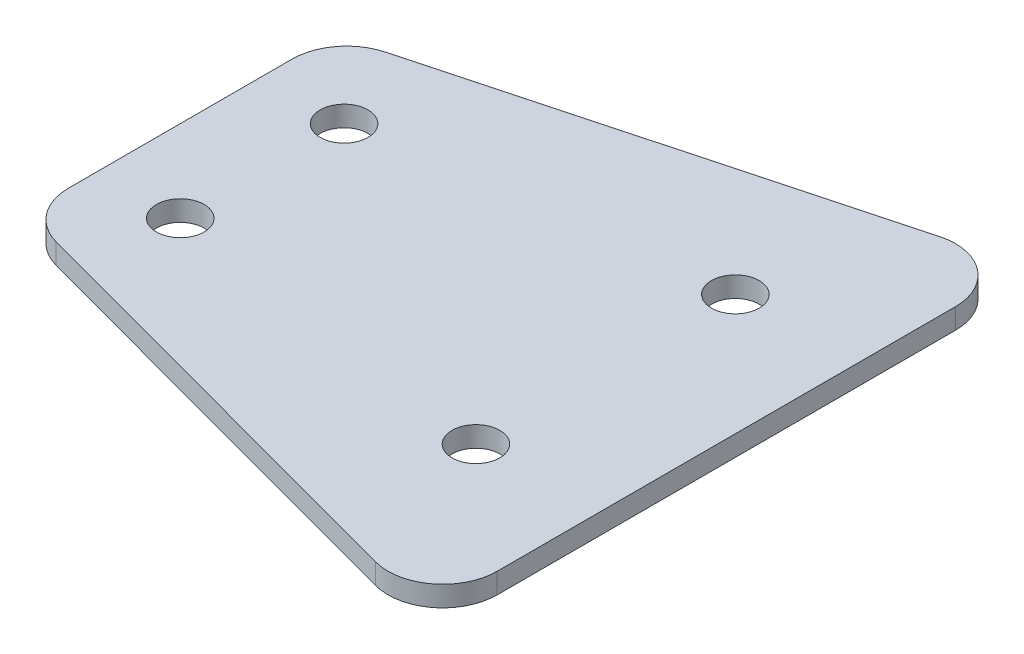
ISO-10303-21;
HEADER;
FILE_DESCRIPTION(('STEP AP214'),'2;1');
FILE_NAME('part.step','',(''),(''),'','','');
FILE_SCHEMA(('AUTOMOTIVE_DESIGN { 1 0 10303 214 1 1 1 1 }'));
ENDSEC;
DATA;
#1=APPLICATION_CONTEXT('core data for automotive mechanical design processes');
#2=APPLICATION_PROTOCOL_DEFINITION('international standard','automotive_design',2000,#1);
#3=PRODUCT_CONTEXT('',#1,'mechanical');
#4=PRODUCT('Part','Part','',(#3));
#5=PRODUCT_RELATED_PRODUCT_CATEGORY('part','',(#4));
#6=PRODUCT_DEFINITION_FORMATION('','',#4);
#7=PRODUCT_DEFINITION_CONTEXT('part definition',#1,'design');
#8=PRODUCT_DEFINITION('design','',#6,#7);
#9=PRODUCT_DEFINITION_SHAPE('','',#8);
#10=(LENGTH_UNIT() NAMED_UNIT(*) SI_UNIT(.MILLI.,.METRE.));
#11=(NAMED_UNIT(*) PLANE_ANGLE_UNIT() SI_UNIT($,.RADIAN.));
#12=(NAMED_UNIT(*) SI_UNIT($,.STERADIAN.) SOLID_ANGLE_UNIT());
#13=UNCERTAINTY_MEASURE_WITH_UNIT(LENGTH_MEASURE(1.E-05),#10,'distance_accuracy_value','');
#14=(GEOMETRIC_REPRESENTATION_CONTEXT(3) GLOBAL_UNCERTAINTY_ASSIGNED_CONTEXT((#13)) GLOBAL_UNIT_ASSIGNED_CONTEXT((#10,
#11,#12)) REPRESENTATION_CONTEXT('',''));
#15=CARTESIAN_POINT('',(0.,0.,0.));
#16=DIRECTION('',(0.,0.,1.));
#17=DIRECTION('',(1.,0.,0.));
#18=AXIS2_PLACEMENT_3D('',#15,#16,#17);
#19=CARTESIAN_POINT('',(-40.,1.5,0.));
#20=DIRECTION('',(-1.,0.,0.));
#21=DIRECTION('',(0.,0.,1.));
#22=AXIS2_PLACEMENT_3D('',#19,#20,#21);
#23=PLANE('',#22);
#24=DIRECTION('',(0.,0.,-1.));
#25=VECTOR('',#24,1.);
#26=CARTESIAN_POINT('',(-40.,-1.5,0.));
#27=LINE('',#26,#25);
#28=CARTESIAN_POINT('',(-40.,-1.5,16.3661301313939));
#29=VERTEX_POINT('',#28);
#30=CARTESIAN_POINT('',(-40.,-1.5,-16.3661301313939));
#31=VERTEX_POINT('',#30);
#32=EDGE_CURVE('E146',#29,#31,#27,.T.);
#33=ORIENTED_EDGE('',*,*,#32,.F.);
#34=DIRECTION('',(0.,-1.,0.));
#35=VECTOR('',#34,1.);
#36=CARTESIAN_POINT('',(-40.,1.5,16.3661301313939));
#37=LINE('',#36,#35);
#38=CARTESIAN_POINT('',(-40.,1.5,16.3661301313939));
#39=VERTEX_POINT('',#38);
#40=EDGE_CURVE('E11',#39,#29,#37,.T.);
#41=ORIENTED_EDGE('',*,*,#40,.F.);
#42=DIRECTION('',(0.,0.,-1.));
#43=VECTOR('',#42,1.);
#44=CARTESIAN_POINT('',(-40.,1.5,0.));
#45=LINE('',#44,#43);
#46=CARTESIAN_POINT('',(-40.,1.5,-16.3661301313939));
#47=VERTEX_POINT('',#46);
#48=EDGE_CURVE('E176',#39,#47,#45,.T.);
#49=ORIENTED_EDGE('',*,*,#48,.T.);
#50=DIRECTION('',(0.,-1.,0.));
#51=VECTOR('',#50,1.);
#52=CARTESIAN_POINT('',(-40.,1.5,-16.3661301313939));
#53=LINE('',#52,#51);
#54=EDGE_CURVE('E66',#47,#31,#53,.T.);
#55=ORIENTED_EDGE('',*,*,#54,.T.);
#56=EDGE_LOOP('',(#33,#41,#49,#55));
#57=FACE_BOUND('',#56,.T.);
#58=ADVANCED_FACE('F51',(#57),#23,.T.);
#59=CARTESIAN_POINT('',(-32.,1.5,16.3661301313939));
#60=DIRECTION('',(0.,-1.,0.));
#61=DIRECTION('',(0.,0.,-1.));
#62=AXIS2_PLACEMENT_3D('',#59,#60,#61);
#63=CYLINDRICAL_SURFACE('',#62,7.99999999999999);
#64=CARTESIAN_POINT('',(-32.,-1.5,16.3661301313939));
#65=DIRECTION('',(0.,1.,0.));
#66=DIRECTION('',(0.,0.,1.));
#67=AXIS2_PLACEMENT_3D('',#64,#65,#66);
#68=CIRCLE('',#67,7.99999999999999);
#69=CARTESIAN_POINT('',(-34.0763242630336,-1.5,24.0919878543097));
#70=VERTEX_POINT('',#69);
#71=EDGE_CURVE('E155',#29,#70,#68,.T.);
#72=ORIENTED_EDGE('',*,*,#71,.T.);
#73=DIRECTION('',(0.,-1.,0.));
#74=VECTOR('',#73,1.);
#75=CARTESIAN_POINT('',(-34.0763242630336,1.5,24.0919878543097));
#76=LINE('',#75,#74);
#77=CARTESIAN_POINT('',(-34.0763242630336,1.5,24.0919878543097));
#78=VERTEX_POINT('',#77);
#79=EDGE_CURVE('E58',#78,#70,#76,.T.);
#80=ORIENTED_EDGE('',*,*,#79,.F.);
#81=CARTESIAN_POINT('',(-32.,1.5,16.3661301313939));
#82=DIRECTION('',(0.,1.,0.));
#83=DIRECTION('',(0.,0.,1.));
#84=AXIS2_PLACEMENT_3D('',#81,#82,#83);
#85=CIRCLE('',#84,7.99999999999999);
#86=EDGE_CURVE('E214',#39,#78,#85,.T.);
#87=ORIENTED_EDGE('',*,*,#86,.F.);
#88=ORIENTED_EDGE('',*,*,#40,.T.);
#89=EDGE_LOOP('',(#72,#80,#87,#88));
#90=FACE_BOUND('',#89,.T.);
#91=ADVANCED_FACE('F279',(#90),#63,.T.);
#92=CARTESIAN_POINT('',(-8.33400123866079,1.5,31.0102371671099));
#93=DIRECTION('',(0.259540532879203,0.,-0.965732215364476));
#94=DIRECTION('',(-0.965732215364476,0.,-0.259540532879203));
#95=AXIS2_PLACEMENT_3D('',#92,#93,#94);
#96=PLANE('',#95);
#97=DIRECTION('',(0.965732215364476,0.,0.259540532879203));
#98=VECTOR('',#97,1.);
#99=CARTESIAN_POINT('',(-8.33400123866079,-1.5,31.0102371671099));
#100=LINE('',#99,#98);
#101=CARTESIAN_POINT('',(29.9236757369664,-1.5,41.2919878543097));
#102=VERTEX_POINT('',#101);
#103=EDGE_CURVE('E158',#70,#102,#100,.T.);
#104=ORIENTED_EDGE('',*,*,#103,.T.);
#105=DIRECTION('',(0.,-1.,0.));
#106=VECTOR('',#105,1.);
#107=CARTESIAN_POINT('',(29.9236757369664,1.5,41.2919878543097));
#108=LINE('',#107,#106);
#109=CARTESIAN_POINT('',(29.9236757369664,1.5,41.2919878543097));
#110=VERTEX_POINT('',#109);
#111=EDGE_CURVE('E187',#110,#102,#108,.T.);
#112=ORIENTED_EDGE('',*,*,#111,.F.);
#113=DIRECTION('',(0.965732215364476,0.,0.259540532879203));
#114=VECTOR('',#113,1.);
#115=CARTESIAN_POINT('',(-8.33400123866079,1.5,31.0102371671099));
#116=LINE('',#115,#114);
#117=EDGE_CURVE('E200',#78,#110,#116,.T.);
#118=ORIENTED_EDGE('',*,*,#117,.F.);
#119=ORIENTED_EDGE('',*,*,#79,.T.);
#120=EDGE_LOOP('',(#104,#112,#118,#119));
#121=FACE_BOUND('',#120,.T.);
#122=ADVANCED_FACE('F193',(#121),#96,.F.);
#123=CARTESIAN_POINT('',(32.,1.5,33.5661301313939));
#124=DIRECTION('',(0.,-1.,0.));
#125=DIRECTION('',(0.,0.,-1.));
#126=AXIS2_PLACEMENT_3D('',#123,#124,#125);
#127=CYLINDRICAL_SURFACE('',#126,8.);
#128=CARTESIAN_POINT('',(32.,-1.5,33.5661301313939));
#129=DIRECTION('',(0.,1.,0.));
#130=DIRECTION('',(0.,0.,1.));
#131=AXIS2_PLACEMENT_3D('',#128,#129,#130);
#132=CIRCLE('',#131,8.);
#133=CARTESIAN_POINT('',(40.,-1.5,33.5661301313939));
#134=VERTEX_POINT('',#133);
#135=EDGE_CURVE('E160',#102,#134,#132,.T.);
#136=ORIENTED_EDGE('',*,*,#135,.T.);
#137=DIRECTION('',(0.,-1.,0.));
#138=VECTOR('',#137,1.);
#139=CARTESIAN_POINT('',(40.,1.5,33.5661301313939));
#140=LINE('',#139,#138);
#141=CARTESIAN_POINT('',(40.,1.5,33.5661301313939));
#142=VERTEX_POINT('',#141);
#143=EDGE_CURVE('E182',#142,#134,#140,.T.);
#144=ORIENTED_EDGE('',*,*,#143,.F.);
#145=CARTESIAN_POINT('',(32.,1.5,33.5661301313939));
#146=DIRECTION('',(0.,1.,0.));
#147=DIRECTION('',(0.,0.,1.));
#148=AXIS2_PLACEMENT_3D('',#145,#146,#147);
#149=CIRCLE('',#148,8.);
#150=EDGE_CURVE('E206',#110,#142,#149,.T.);
#151=ORIENTED_EDGE('',*,*,#150,.F.);
#152=ORIENTED_EDGE('',*,*,#111,.T.);
#153=EDGE_LOOP('',(#136,#144,#151,#152));
#154=FACE_BOUND('',#153,.T.);
#155=ADVANCED_FACE('F207',(#154),#127,.T.);
#156=CARTESIAN_POINT('',(40.,1.5,0.));
#157=DIRECTION('',(1.,0.,0.));
#158=DIRECTION('',(0.,0.,-1.));
#159=AXIS2_PLACEMENT_3D('',#156,#157,#158);
#160=PLANE('',#159);
#161=DIRECTION('',(0.,0.,1.));
#162=VECTOR('',#161,1.);
#163=CARTESIAN_POINT('',(40.,-1.5,0.));
#164=LINE('',#163,#162);
#165=CARTESIAN_POINT('',(40.,-1.5,-33.5661301313939));
#166=VERTEX_POINT('',#165);
#167=EDGE_CURVE('E161',#166,#134,#164,.T.);
#168=ORIENTED_EDGE('',*,*,#167,.F.);
#169=DIRECTION('',(0.,-1.,0.));
#170=VECTOR('',#169,1.);
#171=CARTESIAN_POINT('',(40.,1.5,-33.5661301313939));
#172=LINE('',#171,#170);
#173=CARTESIAN_POINT('',(40.,1.5,-33.5661301313939));
#174=VERTEX_POINT('',#173);
#175=EDGE_CURVE('E129',#174,#166,#172,.T.);
#176=ORIENTED_EDGE('',*,*,#175,.F.);
#177=DIRECTION('',(0.,0.,1.));
#178=VECTOR('',#177,1.);
#179=CARTESIAN_POINT('',(40.,1.5,0.));
#180=LINE('',#179,#178);
#181=EDGE_CURVE('E137',#174,#142,#180,.T.);
#182=ORIENTED_EDGE('',*,*,#181,.T.);
#183=ORIENTED_EDGE('',*,*,#143,.T.);
#184=EDGE_LOOP('',(#168,#176,#182,#183));
#185=FACE_BOUND('',#184,.T.);
#186=ADVANCED_FACE('F292',(#185),#160,.T.);
#187=CARTESIAN_POINT('',(32.,1.5,-33.5661301313939));
#188=DIRECTION('',(0.,-1.,0.));
#189=DIRECTION('',(0.,0.,-1.));
#190=AXIS2_PLACEMENT_3D('',#187,#188,#189);
#191=CYLINDRICAL_SURFACE('',#190,8.);
#192=CARTESIAN_POINT('',(32.,-1.5,-33.5661301313939));
#193=DIRECTION('',(0.,1.,0.));
#194=DIRECTION('',(0.,0.,1.));
#195=AXIS2_PLACEMENT_3D('',#192,#193,#194);
#196=CIRCLE('',#195,8.);
#197=CARTESIAN_POINT('',(29.9236757369664,-1.5,-41.2919878543097));
#198=VERTEX_POINT('',#197);
#199=EDGE_CURVE('E124',#198,#166,#196,.F.);
#200=ORIENTED_EDGE('',*,*,#199,.F.);
#201=DIRECTION('',(0.,-1.,0.));
#202=VECTOR('',#201,1.);
#203=CARTESIAN_POINT('',(29.9236757369664,1.5,-41.2919878543097));
#204=LINE('',#203,#202);
#205=CARTESIAN_POINT('',(29.9236757369664,1.5,-41.2919878543097));
#206=VERTEX_POINT('',#205);
#207=EDGE_CURVE('E117',#206,#198,#204,.T.);
#208=ORIENTED_EDGE('',*,*,#207,.F.);
#209=CARTESIAN_POINT('',(32.,1.5,-33.5661301313939));
#210=DIRECTION('',(0.,1.,0.));
#211=DIRECTION('',(0.,0.,1.));
#212=AXIS2_PLACEMENT_3D('',#209,#210,#211);
#213=CIRCLE('',#212,8.);
#214=EDGE_CURVE('E122',#206,#174,#213,.F.);
#215=ORIENTED_EDGE('',*,*,#214,.T.);
#216=ORIENTED_EDGE('',*,*,#175,.T.);
#217=EDGE_LOOP('',(#200,#208,#215,#216));
#218=FACE_BOUND('',#217,.T.);
#219=ADVANCED_FACE('F119',(#218),#191,.T.);
#220=CARTESIAN_POINT('',(-8.3340012386608,1.5,-31.0102371671099));
#221=DIRECTION('',(-0.259540532879203,0.,-0.965732215364476));
#222=DIRECTION('',(-0.965732215364476,0.,0.259540532879203));
#223=AXIS2_PLACEMENT_3D('',#220,#221,#222);
#224=PLANE('',#223);
#225=DIRECTION('',(0.965732215364476,0.,-0.259540532879203));
#226=VECTOR('',#225,1.);
#227=CARTESIAN_POINT('',(-8.3340012386608,-1.5,-31.0102371671099));
#228=LINE('',#227,#226);
#229=CARTESIAN_POINT('',(-34.0763242630336,-1.5,-24.0919878543097));
#230=VERTEX_POINT('',#229);
#231=EDGE_CURVE('E169',#230,#198,#228,.T.);
#232=ORIENTED_EDGE('',*,*,#231,.F.);
#233=DIRECTION('',(0.,-1.,0.));
#234=VECTOR('',#233,1.);
#235=CARTESIAN_POINT('',(-34.0763242630336,1.5,-24.0919878543097));
#236=LINE('',#235,#234);
#237=CARTESIAN_POINT('',(-34.0763242630336,1.5,-24.0919878543097));
#238=VERTEX_POINT('',#237);
#239=EDGE_CURVE('E92',#238,#230,#236,.T.);
#240=ORIENTED_EDGE('',*,*,#239,.F.);
#241=DIRECTION('',(0.965732215364476,0.,-0.259540532879203));
#242=VECTOR('',#241,1.);
#243=CARTESIAN_POINT('',(-8.3340012386608,1.5,-31.0102371671099));
#244=LINE('',#243,#242);
#245=EDGE_CURVE('E138',#238,#206,#244,.T.);
#246=ORIENTED_EDGE('',*,*,#245,.T.);
#247=ORIENTED_EDGE('',*,*,#207,.T.);
#248=EDGE_LOOP('',(#232,#240,#246,#247));
#249=FACE_BOUND('',#248,.T.);
#250=ADVANCED_FACE('F142',(#249),#224,.T.);
#251=CARTESIAN_POINT('',(-32.,1.5,-16.3661301313939));
#252=DIRECTION('',(0.,-1.,0.));
#253=DIRECTION('',(0.,0.,-1.));
#254=AXIS2_PLACEMENT_3D('',#251,#252,#253);
#255=CYLINDRICAL_SURFACE('',#254,7.99999999999999);
#256=CARTESIAN_POINT('',(-32.,-1.5,-16.3661301313939));
#257=DIRECTION('',(0.,1.,0.));
#258=DIRECTION('',(0.,0.,1.));
#259=AXIS2_PLACEMENT_3D('',#256,#257,#258);
#260=CIRCLE('',#259,7.99999999999999);
#261=EDGE_CURVE('E175',#31,#230,#260,.F.);
#262=ORIENTED_EDGE('',*,*,#261,.F.);
#263=ORIENTED_EDGE('',*,*,#54,.F.);
#264=CARTESIAN_POINT('',(-32.,1.5,-16.3661301313939));
#265=DIRECTION('',(0.,1.,0.));
#266=DIRECTION('',(0.,0.,1.));
#267=AXIS2_PLACEMENT_3D('',#264,#265,#266);
#268=CIRCLE('',#267,7.99999999999999);
#269=EDGE_CURVE('E141',#47,#238,#268,.F.);
#270=ORIENTED_EDGE('',*,*,#269,.T.);
#271=ORIENTED_EDGE('',*,*,#239,.T.);
#272=EDGE_LOOP('',(#262,#263,#270,#271));
#273=FACE_BOUND('',#272,.T.);
#274=ADVANCED_FACE('F257',(#273),#255,.T.);
#275=CARTESIAN_POINT('',(0.,1.5,0.));
#276=DIRECTION('',(0.,1.,0.));
#277=DIRECTION('',(0.,0.,1.));
#278=AXIS2_PLACEMENT_3D('',#275,#276,#277);
#279=PLANE('',#278);
#280=CARTESIAN_POINT('',(-28.,1.5,-12.));
#281=DIRECTION('',(0.,1.,0.));
#282=DIRECTION('',(0.,0.,1.));
#283=AXIS2_PLACEMENT_3D('',#280,#281,#282);
#284=CIRCLE('',#283,3.5);
#285=CARTESIAN_POINT('',(-28.,1.5,-8.5));
#286=VERTEX_POINT('',#285);
#287=EDGE_CURVE('E225',#286,#286,#284,.T.);
#288=ORIENTED_EDGE('',*,*,#287,.F.);
#289=EDGE_LOOP('',(#288));
#290=FACE_BOUND('',#289,.T.);
#291=CARTESIAN_POINT('',(22.3154051956257,1.5,19.));
#292=DIRECTION('',(0.,1.,0.));
#293=DIRECTION('',(0.,0.,-1.));
#294=AXIS2_PLACEMENT_3D('',#291,#292,#293);
#295=CIRCLE('',#294,3.5);
#296=CARTESIAN_POINT('',(22.3154051956257,1.5,15.5));
#297=VERTEX_POINT('',#296);
#298=EDGE_CURVE('E235',#297,#297,#295,.T.);
#299=ORIENTED_EDGE('',*,*,#298,.F.);
#300=EDGE_LOOP('',(#299));
#301=FACE_BOUND('',#300,.T.);
#302=CARTESIAN_POINT('',(-28.,1.5,12.));
#303=DIRECTION('',(0.,1.,0.));
#304=DIRECTION('',(0.,0.,-1.));
#305=AXIS2_PLACEMENT_3D('',#302,#303,#304);
#306=CIRCLE('',#305,3.5);
#307=CARTESIAN_POINT('',(-28.,1.5,8.5));
#308=VERTEX_POINT('',#307);
#309=EDGE_CURVE('E231',#308,#308,#306,.T.);
#310=ORIENTED_EDGE('',*,*,#309,.F.);
#311=EDGE_LOOP('',(#310));
#312=FACE_BOUND('',#311,.T.);
#313=CARTESIAN_POINT('',(22.3154051956257,1.5,-19.));
#314=DIRECTION('',(0.,1.,0.));
#315=DIRECTION('',(0.,0.,1.));
#316=AXIS2_PLACEMENT_3D('',#313,#314,#315);
#317=CIRCLE('',#316,3.5);
#318=CARTESIAN_POINT('',(22.3154051956257,1.5,-15.5));
#319=VERTEX_POINT('',#318);
#320=EDGE_CURVE('E217',#319,#319,#317,.T.);
#321=ORIENTED_EDGE('',*,*,#320,.F.);
#322=EDGE_LOOP('',(#321));
#323=FACE_BOUND('',#322,.T.);
#324=ORIENTED_EDGE('',*,*,#48,.F.);
#325=ORIENTED_EDGE('',*,*,#86,.T.);
#326=ORIENTED_EDGE('',*,*,#117,.T.);
#327=ORIENTED_EDGE('',*,*,#150,.T.);
#328=ORIENTED_EDGE('',*,*,#181,.F.);
#329=ORIENTED_EDGE('',*,*,#214,.F.);
#330=ORIENTED_EDGE('',*,*,#245,.F.);
#331=ORIENTED_EDGE('',*,*,#269,.F.);
#332=EDGE_LOOP('',(#324,#325,#326,#327,#328,#329,#330,#331));
#333=FACE_BOUND('',#332,.T.);
#334=ADVANCED_FACE('F134',(#290,#301,#312,#323,#333),#279,.T.);
#335=CARTESIAN_POINT('',(0.,-1.5,0.));
#336=DIRECTION('',(0.,1.,0.));
#337=DIRECTION('',(0.,0.,1.));
#338=AXIS2_PLACEMENT_3D('',#335,#336,#337);
#339=PLANE('',#338);
#340=CARTESIAN_POINT('',(-28.,-1.5,-12.));
#341=DIRECTION('',(0.,1.,0.));
#342=DIRECTION('',(0.,0.,1.));
#343=AXIS2_PLACEMENT_3D('',#340,#341,#342);
#344=CIRCLE('',#343,3.5);
#345=CARTESIAN_POINT('',(-28.,-1.5,-8.5));
#346=VERTEX_POINT('',#345);
#347=EDGE_CURVE('E240',#346,#346,#344,.T.);
#348=ORIENTED_EDGE('',*,*,#347,.T.);
#349=EDGE_LOOP('',(#348));
#350=FACE_BOUND('',#349,.T.);
#351=CARTESIAN_POINT('',(22.3154051956257,-1.5,19.));
#352=DIRECTION('',(0.,1.,0.));
#353=DIRECTION('',(0.,0.,-1.));
#354=AXIS2_PLACEMENT_3D('',#351,#352,#353);
#355=CIRCLE('',#354,3.5);
#356=CARTESIAN_POINT('',(22.3154051956257,-1.5,15.5));
#357=VERTEX_POINT('',#356);
#358=EDGE_CURVE('E226',#357,#357,#355,.T.);
#359=ORIENTED_EDGE('',*,*,#358,.T.);
#360=EDGE_LOOP('',(#359));
#361=FACE_BOUND('',#360,.T.);
#362=CARTESIAN_POINT('',(-28.,-1.5,12.));
#363=DIRECTION('',(0.,1.,0.));
#364=DIRECTION('',(0.,0.,-1.));
#365=AXIS2_PLACEMENT_3D('',#362,#363,#364);
#366=CIRCLE('',#365,3.5);
#367=CARTESIAN_POINT('',(-28.,-1.5,8.5));
#368=VERTEX_POINT('',#367);
#369=EDGE_CURVE('E242',#368,#368,#366,.T.);
#370=ORIENTED_EDGE('',*,*,#369,.T.);
#371=EDGE_LOOP('',(#370));
#372=FACE_BOUND('',#371,.T.);
#373=CARTESIAN_POINT('',(22.3154051956257,-1.5,-19.));
#374=DIRECTION('',(0.,1.,0.));
#375=DIRECTION('',(0.,0.,1.));
#376=AXIS2_PLACEMENT_3D('',#373,#374,#375);
#377=CIRCLE('',#376,3.5);
#378=CARTESIAN_POINT('',(22.3154051956257,-1.5,-15.5));
#379=VERTEX_POINT('',#378);
#380=EDGE_CURVE('E151',#379,#379,#377,.T.);
#381=ORIENTED_EDGE('',*,*,#380,.T.);
#382=EDGE_LOOP('',(#381));
#383=FACE_BOUND('',#382,.T.);
#384=ORIENTED_EDGE('',*,*,#32,.T.);
#385=ORIENTED_EDGE('',*,*,#261,.T.);
#386=ORIENTED_EDGE('',*,*,#231,.T.);
#387=ORIENTED_EDGE('',*,*,#199,.T.);
#388=ORIENTED_EDGE('',*,*,#167,.T.);
#389=ORIENTED_EDGE('',*,*,#135,.F.);
#390=ORIENTED_EDGE('',*,*,#103,.F.);
#391=ORIENTED_EDGE('',*,*,#71,.F.);
#392=EDGE_LOOP('',(#384,#385,#386,#387,#388,#389,#390,#391));
#393=FACE_BOUND('',#392,.T.);
#394=ADVANCED_FACE('F204',(#350,#361,#372,#383,#393),#339,.F.);
#395=CARTESIAN_POINT('',(22.3154051956257,-1.5,-19.));
#396=DIRECTION('',(0.,1.,0.));
#397=DIRECTION('',(0.,0.,1.));
#398=AXIS2_PLACEMENT_3D('',#395,#396,#397);
#399=CYLINDRICAL_SURFACE('',#398,3.5);
#400=ORIENTED_EDGE('',*,*,#380,.F.);
#401=EDGE_LOOP('',(#400));
#402=FACE_BOUND('',#401,.T.);
#403=ORIENTED_EDGE('',*,*,#320,.T.);
#404=EDGE_LOOP('',(#403));
#405=FACE_BOUND('',#404,.T.);
#406=ADVANCED_FACE('F263',(#402,#405),#399,.F.);
#407=CARTESIAN_POINT('',(-28.,-1.5,12.));
#408=DIRECTION('',(0.,1.,0.));
#409=DIRECTION('',(0.,0.,1.));
#410=AXIS2_PLACEMENT_3D('',#407,#408,#409);
#411=CYLINDRICAL_SURFACE('',#410,3.5);
#412=ORIENTED_EDGE('',*,*,#369,.F.);
#413=EDGE_LOOP('',(#412));
#414=FACE_BOUND('',#413,.T.);
#415=ORIENTED_EDGE('',*,*,#309,.T.);
#416=EDGE_LOOP('',(#415));
#417=FACE_BOUND('',#416,.T.);
#418=ADVANCED_FACE('F255',(#414,#417),#411,.F.);
#419=CARTESIAN_POINT('',(22.3154051956257,-1.5,19.));
#420=DIRECTION('',(0.,1.,0.));
#421=DIRECTION('',(0.,0.,1.));
#422=AXIS2_PLACEMENT_3D('',#419,#420,#421);
#423=CYLINDRICAL_SURFACE('',#422,3.5);
#424=ORIENTED_EDGE('',*,*,#358,.F.);
#425=EDGE_LOOP('',(#424));
#426=FACE_BOUND('',#425,.T.);
#427=ORIENTED_EDGE('',*,*,#298,.T.);
#428=EDGE_LOOP('',(#427));
#429=FACE_BOUND('',#428,.T.);
#430=ADVANCED_FACE('F270',(#426,#429),#423,.F.);
#431=CARTESIAN_POINT('',(-28.,-1.5,-12.));
#432=DIRECTION('',(0.,1.,0.));
#433=DIRECTION('',(0.,0.,1.));
#434=AXIS2_PLACEMENT_3D('',#431,#432,#433);
#435=CYLINDRICAL_SURFACE('',#434,3.5);
#436=ORIENTED_EDGE('',*,*,#347,.F.);
#437=EDGE_LOOP('',(#436));
#438=FACE_BOUND('',#437,.T.);
#439=ORIENTED_EDGE('',*,*,#287,.T.);
#440=EDGE_LOOP('',(#439));
#441=FACE_BOUND('',#440,.T.);
#442=ADVANCED_FACE('F346',(#438,#441),#435,.F.);
#443=CLOSED_SHELL('',(#58,#91,#122,#155,#186,#219,#250,#274,#334,#394,#406,#418,#430,#442));
#444=MANIFOLD_SOLID_BREP('B2',#443);
#445=ADVANCED_BREP_SHAPE_REPRESENTATION('',(#18,#444),#14);
#446=SHAPE_DEFINITION_REPRESENTATION(#9,#445);
ENDSEC;
END-ISO-10303-21;
